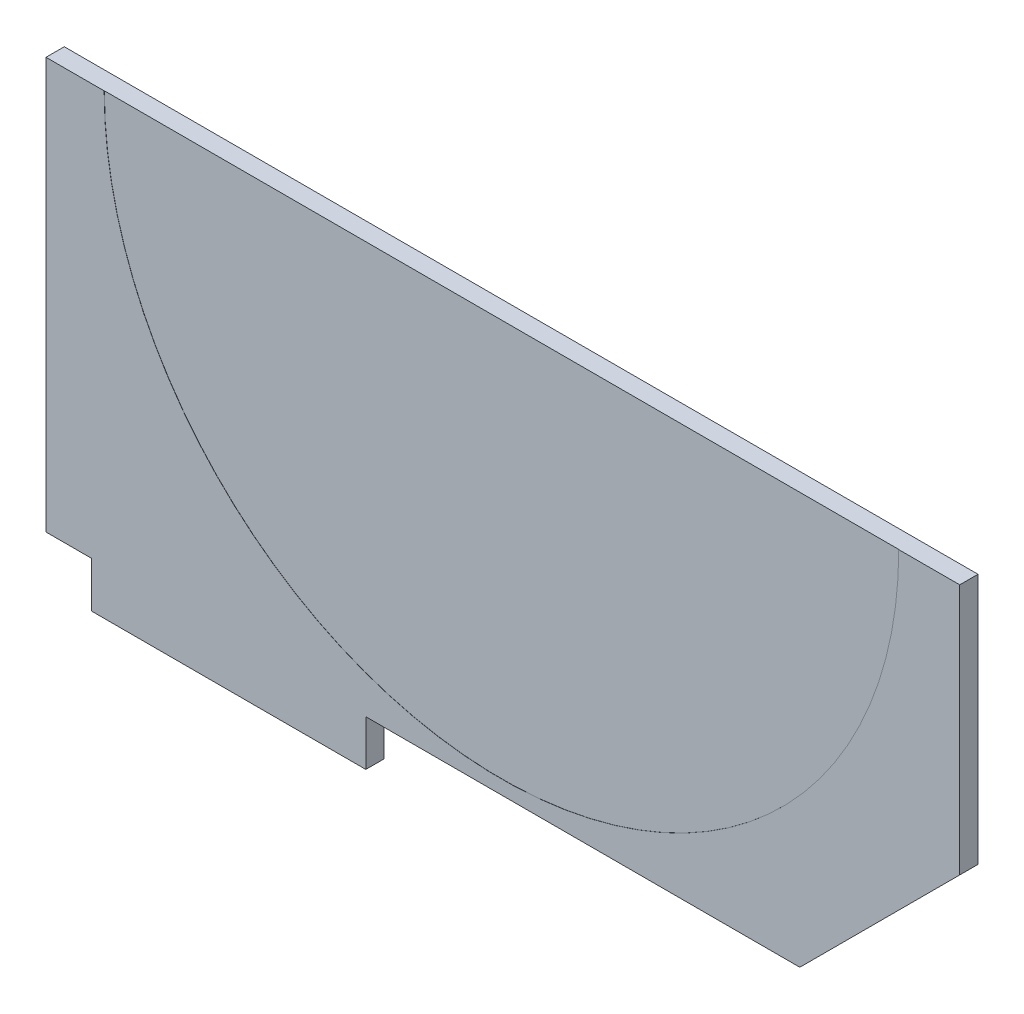
ISO-10303-21;
HEADER;
FILE_DESCRIPTION(('STEP AP214'),'2;1');
FILE_NAME('part.step','',(''),(''),'','','');
FILE_SCHEMA(('AUTOMOTIVE_DESIGN { 1 0 10303 214 1 1 1 1 }'));
ENDSEC;
DATA;
#1=APPLICATION_CONTEXT('core data for automotive mechanical design processes');
#2=APPLICATION_PROTOCOL_DEFINITION('international standard','automotive_design',2000,#1);
#3=PRODUCT_CONTEXT('',#1,'mechanical');
#4=PRODUCT('Part','Part','',(#3));
#5=PRODUCT_RELATED_PRODUCT_CATEGORY('part','',(#4));
#6=PRODUCT_DEFINITION_FORMATION('','',#4);
#7=PRODUCT_DEFINITION_CONTEXT('part definition',#1,'design');
#8=PRODUCT_DEFINITION('design','',#6,#7);
#9=PRODUCT_DEFINITION_SHAPE('','',#8);
#10=(LENGTH_UNIT() NAMED_UNIT(*) SI_UNIT(.MILLI.,.METRE.));
#11=(NAMED_UNIT(*) PLANE_ANGLE_UNIT() SI_UNIT($,.RADIAN.));
#12=(NAMED_UNIT(*) SI_UNIT($,.STERADIAN.) SOLID_ANGLE_UNIT());
#13=UNCERTAINTY_MEASURE_WITH_UNIT(LENGTH_MEASURE(1.E-05),#10,'distance_accuracy_value','');
#14=(GEOMETRIC_REPRESENTATION_CONTEXT(3) GLOBAL_UNCERTAINTY_ASSIGNED_CONTEXT((#13)) GLOBAL_UNIT_ASSIGNED_CONTEXT((#10,
#11,#12)) REPRESENTATION_CONTEXT('',''));
#15=CARTESIAN_POINT('',(0.,0.,0.));
#16=DIRECTION('',(0.,0.,1.));
#17=DIRECTION('',(1.,0.,0.));
#18=AXIS2_PLACEMENT_3D('',#15,#16,#17);
#19=CARTESIAN_POINT('',(0.,0.,0.19));
#20=DIRECTION('',(0.,0.,-1.));
#21=DIRECTION('',(-1.,0.,0.));
#22=AXIS2_PLACEMENT_3D('',#19,#20,#21);
#23=PLANE('',#22);
#24=CARTESIAN_POINT('',(-0.450773361976369,0.800000000000001,0.19));
#25=DIRECTION('',(0.,0.,1.));
#26=DIRECTION('',(-1.,0.,0.));
#27=AXIS2_PLACEMENT_3D('',#24,#25,#26);
#28=CIRCLE('',#27,0.217416756176155);
#29=CARTESIAN_POINT('',(-0.668190118152524,0.800000000000001,0.19));
#30=VERTEX_POINT('',#29);
#31=CARTESIAN_POINT('',(-0.233356605800214,0.800000000000001,0.19));
#32=VERTEX_POINT('',#31);
#33=EDGE_CURVE('E11',#30,#32,#28,.T.);
#34=ORIENTED_EDGE('',*,*,#33,.F.);
#35=DIRECTION('',(1.,0.,0.));
#36=VECTOR('',#35,1.);
#37=CARTESIAN_POINT('',(-0.7,0.800000000000001,0.19));
#38=LINE('',#37,#36);
#39=CARTESIAN_POINT('',(-0.7,0.800000000000001,0.19));
#40=VERTEX_POINT('',#39);
#41=EDGE_CURVE('E24',#40,#30,#38,.T.);
#42=ORIENTED_EDGE('',*,*,#41,.F.);
#43=DIRECTION('',(0.,1.,0.));
#44=VECTOR('',#43,1.);
#45=CARTESIAN_POINT('',(-0.7,0.57499996547462,0.19));
#46=LINE('',#45,#44);
#47=CARTESIAN_POINT('',(-0.7,0.57499996547462,0.19));
#48=VERTEX_POINT('',#47);
#49=EDGE_CURVE('E192',#48,#40,#46,.T.);
#50=ORIENTED_EDGE('',*,*,#49,.F.);
#51=DIRECTION('',(-1.,0.,0.));
#52=VECTOR('',#51,1.);
#53=CARTESIAN_POINT('',(-0.675000034525379,0.57499996547462,0.19));
#54=LINE('',#53,#52);
#55=CARTESIAN_POINT('',(-0.675000034525379,0.57499996547462,0.19));
#56=VERTEX_POINT('',#55);
#57=EDGE_CURVE('E190',#56,#48,#54,.T.);
#58=ORIENTED_EDGE('',*,*,#57,.F.);
#59=DIRECTION('',(0.,1.,0.));
#60=VECTOR('',#59,1.);
#61=CARTESIAN_POINT('',(-0.675000034525379,0.55,0.19));
#62=LINE('',#61,#60);
#63=CARTESIAN_POINT('',(-0.675000034525379,0.55,0.19));
#64=VERTEX_POINT('',#63);
#65=EDGE_CURVE('E102',#64,#56,#62,.T.);
#66=ORIENTED_EDGE('',*,*,#65,.F.);
#67=DIRECTION('',(-1.,0.,0.));
#68=VECTOR('',#67,1.);
#69=CARTESIAN_POINT('',(-0.525000034525379,0.55,0.19));
#70=LINE('',#69,#68);
#71=CARTESIAN_POINT('',(-0.525000034525379,0.55,0.19));
#72=VERTEX_POINT('',#71);
#73=EDGE_CURVE('E186',#72,#64,#70,.T.);
#74=ORIENTED_EDGE('',*,*,#73,.F.);
#75=DIRECTION('',(0.,-1.,0.));
#76=VECTOR('',#75,1.);
#77=CARTESIAN_POINT('',(-0.525000034525379,0.57499996547462,0.19));
#78=LINE('',#77,#76);
#79=CARTESIAN_POINT('',(-0.525000034525379,0.57499996547462,0.19));
#80=VERTEX_POINT('',#79);
#81=EDGE_CURVE('E183',#80,#72,#78,.T.);
#82=ORIENTED_EDGE('',*,*,#81,.F.);
#83=DIRECTION('',(-1.,0.,0.));
#84=VECTOR('',#83,1.);
#85=CARTESIAN_POINT('',(-0.287497534525379,0.57499996547462,0.19));
#86=LINE('',#85,#84);
#87=CARTESIAN_POINT('',(-0.287497534525379,0.57499996547462,0.19));
#88=VERTEX_POINT('',#87);
#89=EDGE_CURVE('E180',#88,#80,#86,.T.);
#90=ORIENTED_EDGE('',*,*,#89,.F.);
#91=DIRECTION('',(-0.707106781186547,-0.707106781186548,0.));
#92=VECTOR('',#91,1.);
#93=CARTESIAN_POINT('',(-0.287497534525379,0.57499996547462,0.19));
#94=LINE('',#93,#92);
#95=CARTESIAN_POINT('',(-0.2,0.6624975,0.19));
#96=VERTEX_POINT('',#95);
#97=EDGE_CURVE('E177',#96,#88,#94,.T.);
#98=ORIENTED_EDGE('',*,*,#97,.F.);
#99=DIRECTION('',(0.,-1.,0.));
#100=VECTOR('',#99,1.);
#101=CARTESIAN_POINT('',(-0.2,0.800000000000001,0.19));
#102=LINE('',#101,#100);
#103=CARTESIAN_POINT('',(-0.2,0.800000000000001,0.19));
#104=VERTEX_POINT('',#103);
#105=EDGE_CURVE('E174',#104,#96,#102,.T.);
#106=ORIENTED_EDGE('',*,*,#105,.F.);
#107=DIRECTION('',(1.,0.,0.));
#108=VECTOR('',#107,1.);
#109=CARTESIAN_POINT('',(-0.7,0.800000000000001,0.19));
#110=LINE('',#109,#108);
#111=EDGE_CURVE('E171',#32,#104,#110,.T.);
#112=ORIENTED_EDGE('',*,*,#111,.F.);
#113=EDGE_LOOP('',(#34,#42,#50,#58,#66,#74,#82,#90,#98,#106,#112));
#114=FACE_BOUND('',#113,.T.);
#115=ADVANCED_FACE('F17',(#114),#23,.F.);
#116=CARTESIAN_POINT('',(-0.7,0.57499996547462,0.18));
#117=DIRECTION('',(1.,0.,0.));
#118=DIRECTION('',(0.,1.,0.));
#119=AXIS2_PLACEMENT_3D('',#116,#117,#118);
#120=PLANE('',#119);
#121=ORIENTED_EDGE('',*,*,#49,.T.);
#122=DIRECTION('',(0.,0.,1.));
#123=VECTOR('',#122,1.);
#124=CARTESIAN_POINT('',(-0.7,0.800000000000001,0.18));
#125=LINE('',#124,#123);
#126=CARTESIAN_POINT('',(-0.7,0.800000000000001,0.18));
#127=VERTEX_POINT('',#126);
#128=EDGE_CURVE('E168',#127,#40,#125,.T.);
#129=ORIENTED_EDGE('',*,*,#128,.F.);
#130=DIRECTION('',(0.,1.,0.));
#131=VECTOR('',#130,1.);
#132=CARTESIAN_POINT('',(-0.7,0.57499996547462,0.18));
#133=LINE('',#132,#131);
#134=CARTESIAN_POINT('',(-0.7,0.57499996547462,0.18));
#135=VERTEX_POINT('',#134);
#136=EDGE_CURVE('E166',#135,#127,#133,.T.);
#137=ORIENTED_EDGE('',*,*,#136,.F.);
#138=DIRECTION('',(0.,0.,1.));
#139=VECTOR('',#138,1.);
#140=CARTESIAN_POINT('',(-0.7,0.57499996547462,0.18));
#141=LINE('',#140,#139);
#142=EDGE_CURVE('E120',#135,#48,#141,.T.);
#143=ORIENTED_EDGE('',*,*,#142,.T.);
#144=EDGE_LOOP('',(#121,#129,#137,#143));
#145=FACE_BOUND('',#144,.T.);
#146=ADVANCED_FACE('F217',(#145),#120,.F.);
#147=CARTESIAN_POINT('',(-0.7,0.800000000000001,0.18));
#148=DIRECTION('',(0.,-1.,0.));
#149=DIRECTION('',(0.,0.,-1.));
#150=AXIS2_PLACEMENT_3D('',#147,#148,#149);
#151=PLANE('',#150);
#152=DIRECTION('',(-1.,0.,0.));
#153=VECTOR('',#152,1.);
#154=CARTESIAN_POINT('',(-0.668190118152524,0.800000000000001,0.1899));
#155=LINE('',#154,#153);
#156=CARTESIAN_POINT('',(-0.233356605800214,0.800000000000001,0.1899));
#157=VERTEX_POINT('',#156);
#158=CARTESIAN_POINT('',(-0.668190118152524,0.800000000000001,0.1899));
#159=VERTEX_POINT('',#158);
#160=EDGE_CURVE('E163',#157,#159,#155,.T.);
#161=ORIENTED_EDGE('',*,*,#160,.F.);
#162=DIRECTION('',(0.,0.,1.));
#163=VECTOR('',#162,1.);
#164=CARTESIAN_POINT('',(-0.233356605800214,0.800000000000001,0.1899));
#165=LINE('',#164,#163);
#166=EDGE_CURVE('E160',#157,#32,#165,.T.);
#167=ORIENTED_EDGE('',*,*,#166,.T.);
#168=ORIENTED_EDGE('',*,*,#111,.T.);
#169=DIRECTION('',(0.,0.,1.));
#170=VECTOR('',#169,1.);
#171=CARTESIAN_POINT('',(-0.2,0.800000000000001,0.18));
#172=LINE('',#171,#170);
#173=CARTESIAN_POINT('',(-0.2,0.800000000000001,0.18));
#174=VERTEX_POINT('',#173);
#175=EDGE_CURVE('E157',#174,#104,#172,.T.);
#176=ORIENTED_EDGE('',*,*,#175,.F.);
#177=DIRECTION('',(1.,0.,0.));
#178=VECTOR('',#177,1.);
#179=CARTESIAN_POINT('',(-0.7,0.800000000000001,0.18));
#180=LINE('',#179,#178);
#181=EDGE_CURVE('E154',#127,#174,#180,.T.);
#182=ORIENTED_EDGE('',*,*,#181,.F.);
#183=ORIENTED_EDGE('',*,*,#128,.T.);
#184=ORIENTED_EDGE('',*,*,#41,.T.);
#185=DIRECTION('',(0.,0.,1.));
#186=VECTOR('',#185,1.);
#187=CARTESIAN_POINT('',(-0.668190118152524,0.800000000000001,0.1899));
#188=LINE('',#187,#186);
#189=EDGE_CURVE('E152',#159,#30,#188,.T.);
#190=ORIENTED_EDGE('',*,*,#189,.F.);
#191=EDGE_LOOP('',(#161,#167,#168,#176,#182,#183,#184,#190));
#192=FACE_BOUND('',#191,.T.);
#193=ADVANCED_FACE('F196',(#192),#151,.F.);
#194=CARTESIAN_POINT('',(-0.2,0.800000000000001,0.18));
#195=DIRECTION('',(-1.,0.,0.));
#196=DIRECTION('',(0.,-1.,0.));
#197=AXIS2_PLACEMENT_3D('',#194,#195,#196);
#198=PLANE('',#197);
#199=ORIENTED_EDGE('',*,*,#105,.T.);
#200=DIRECTION('',(0.,0.,1.));
#201=VECTOR('',#200,1.);
#202=CARTESIAN_POINT('',(-0.2,0.6624975,0.18));
#203=LINE('',#202,#201);
#204=CARTESIAN_POINT('',(-0.2,0.6624975,0.18));
#205=VERTEX_POINT('',#204);
#206=EDGE_CURVE('E149',#205,#96,#203,.T.);
#207=ORIENTED_EDGE('',*,*,#206,.F.);
#208=DIRECTION('',(0.,-1.,0.));
#209=VECTOR('',#208,1.);
#210=CARTESIAN_POINT('',(-0.2,0.800000000000001,0.18));
#211=LINE('',#210,#209);
#212=EDGE_CURVE('E146',#174,#205,#211,.T.);
#213=ORIENTED_EDGE('',*,*,#212,.F.);
#214=ORIENTED_EDGE('',*,*,#175,.T.);
#215=EDGE_LOOP('',(#199,#207,#213,#214));
#216=FACE_BOUND('',#215,.T.);
#217=ADVANCED_FACE('F204',(#216),#198,.F.);
#218=CARTESIAN_POINT('',(-0.287497534525379,0.57499996547462,0.18));
#219=DIRECTION('',(-0.707106781186548,0.707106781186547,0.));
#220=DIRECTION('',(-0.707106781186547,-0.707106781186548,0.));
#221=AXIS2_PLACEMENT_3D('',#218,#219,#220);
#222=PLANE('',#221);
#223=ORIENTED_EDGE('',*,*,#97,.T.);
#224=DIRECTION('',(0.,0.,1.));
#225=VECTOR('',#224,1.);
#226=CARTESIAN_POINT('',(-0.287497534525379,0.57499996547462,0.18));
#227=LINE('',#226,#225);
#228=CARTESIAN_POINT('',(-0.287497534525379,0.57499996547462,0.18));
#229=VERTEX_POINT('',#228);
#230=EDGE_CURVE('E143',#229,#88,#227,.T.);
#231=ORIENTED_EDGE('',*,*,#230,.F.);
#232=DIRECTION('',(-0.707106781186547,-0.707106781186548,0.));
#233=VECTOR('',#232,1.);
#234=CARTESIAN_POINT('',(-0.287497534525379,0.57499996547462,0.18));
#235=LINE('',#234,#233);
#236=EDGE_CURVE('E140',#205,#229,#235,.T.);
#237=ORIENTED_EDGE('',*,*,#236,.F.);
#238=ORIENTED_EDGE('',*,*,#206,.T.);
#239=EDGE_LOOP('',(#223,#231,#237,#238));
#240=FACE_BOUND('',#239,.T.);
#241=ADVANCED_FACE('F208',(#240),#222,.F.);
#242=CARTESIAN_POINT('',(-0.287497534525379,0.57499996547462,0.18));
#243=DIRECTION('',(0.,1.,0.));
#244=DIRECTION('',(0.,0.,1.));
#245=AXIS2_PLACEMENT_3D('',#242,#243,#244);
#246=PLANE('',#245);
#247=ORIENTED_EDGE('',*,*,#89,.T.);
#248=DIRECTION('',(0.,0.,1.));
#249=VECTOR('',#248,1.);
#250=CARTESIAN_POINT('',(-0.525000034525379,0.57499996547462,0.18));
#251=LINE('',#250,#249);
#252=CARTESIAN_POINT('',(-0.525000034525379,0.57499996547462,0.18));
#253=VERTEX_POINT('',#252);
#254=EDGE_CURVE('E137',#253,#80,#251,.T.);
#255=ORIENTED_EDGE('',*,*,#254,.F.);
#256=DIRECTION('',(-1.,0.,0.));
#257=VECTOR('',#256,1.);
#258=CARTESIAN_POINT('',(-0.287497534525379,0.57499996547462,0.18));
#259=LINE('',#258,#257);
#260=EDGE_CURVE('E134',#229,#253,#259,.T.);
#261=ORIENTED_EDGE('',*,*,#260,.F.);
#262=ORIENTED_EDGE('',*,*,#230,.T.);
#263=EDGE_LOOP('',(#247,#255,#261,#262));
#264=FACE_BOUND('',#263,.T.);
#265=ADVANCED_FACE('F210',(#264),#246,.F.);
#266=CARTESIAN_POINT('',(-0.525000034525379,0.57499996547462,0.18));
#267=DIRECTION('',(-1.,0.,0.));
#268=DIRECTION('',(0.,0.,1.));
#269=AXIS2_PLACEMENT_3D('',#266,#267,#268);
#270=PLANE('',#269);
#271=ORIENTED_EDGE('',*,*,#81,.T.);
#272=DIRECTION('',(0.,0.,1.));
#273=VECTOR('',#272,1.);
#274=CARTESIAN_POINT('',(-0.525000034525379,0.55,0.18));
#275=LINE('',#274,#273);
#276=CARTESIAN_POINT('',(-0.525000034525379,0.55,0.18));
#277=VERTEX_POINT('',#276);
#278=EDGE_CURVE('E131',#277,#72,#275,.T.);
#279=ORIENTED_EDGE('',*,*,#278,.F.);
#280=DIRECTION('',(0.,-1.,0.));
#281=VECTOR('',#280,1.);
#282=CARTESIAN_POINT('',(-0.525000034525379,0.57499996547462,0.18));
#283=LINE('',#282,#281);
#284=EDGE_CURVE('E129',#253,#277,#283,.T.);
#285=ORIENTED_EDGE('',*,*,#284,.F.);
#286=ORIENTED_EDGE('',*,*,#254,.T.);
#287=EDGE_LOOP('',(#271,#279,#285,#286));
#288=FACE_BOUND('',#287,.T.);
#289=ADVANCED_FACE('F213',(#288),#270,.F.);
#290=CARTESIAN_POINT('',(-0.525000034525379,0.55,0.18));
#291=DIRECTION('',(0.,1.,0.));
#292=DIRECTION('',(0.,0.,1.));
#293=AXIS2_PLACEMENT_3D('',#290,#291,#292);
#294=PLANE('',#293);
#295=ORIENTED_EDGE('',*,*,#73,.T.);
#296=DIRECTION('',(0.,0.,1.));
#297=VECTOR('',#296,1.);
#298=CARTESIAN_POINT('',(-0.675000034525379,0.55,0.18));
#299=LINE('',#298,#297);
#300=CARTESIAN_POINT('',(-0.675000034525379,0.55,0.18));
#301=VERTEX_POINT('',#300);
#302=EDGE_CURVE('E127',#301,#64,#299,.T.);
#303=ORIENTED_EDGE('',*,*,#302,.F.);
#304=DIRECTION('',(-1.,0.,0.));
#305=VECTOR('',#304,1.);
#306=CARTESIAN_POINT('',(-0.525000034525379,0.55,0.18));
#307=LINE('',#306,#305);
#308=EDGE_CURVE('E106',#277,#301,#307,.T.);
#309=ORIENTED_EDGE('',*,*,#308,.F.);
#310=ORIENTED_EDGE('',*,*,#278,.T.);
#311=EDGE_LOOP('',(#295,#303,#309,#310));
#312=FACE_BOUND('',#311,.T.);
#313=ADVANCED_FACE('F215',(#312),#294,.F.);
#314=CARTESIAN_POINT('',(-0.675000034525379,0.55,0.18));
#315=DIRECTION('',(1.,0.,0.));
#316=DIRECTION('',(0.,0.,-1.));
#317=AXIS2_PLACEMENT_3D('',#314,#315,#316);
#318=PLANE('',#317);
#319=ORIENTED_EDGE('',*,*,#65,.T.);
#320=DIRECTION('',(0.,0.,1.));
#321=VECTOR('',#320,1.);
#322=CARTESIAN_POINT('',(-0.675000034525379,0.57499996547462,0.18));
#323=LINE('',#322,#321);
#324=CARTESIAN_POINT('',(-0.675000034525379,0.57499996547462,0.18));
#325=VERTEX_POINT('',#324);
#326=EDGE_CURVE('E97',#325,#56,#323,.T.);
#327=ORIENTED_EDGE('',*,*,#326,.F.);
#328=DIRECTION('',(0.,1.,0.));
#329=VECTOR('',#328,1.);
#330=CARTESIAN_POINT('',(-0.675000034525379,0.55,0.18));
#331=LINE('',#330,#329);
#332=EDGE_CURVE('E101',#301,#325,#331,.T.);
#333=ORIENTED_EDGE('',*,*,#332,.F.);
#334=ORIENTED_EDGE('',*,*,#302,.T.);
#335=EDGE_LOOP('',(#319,#327,#333,#334));
#336=FACE_BOUND('',#335,.T.);
#337=ADVANCED_FACE('F99',(#336),#318,.F.);
#338=CARTESIAN_POINT('',(-0.675000034525379,0.57499996547462,0.18));
#339=DIRECTION('',(0.,1.,0.));
#340=DIRECTION('',(0.,0.,1.));
#341=AXIS2_PLACEMENT_3D('',#338,#339,#340);
#342=PLANE('',#341);
#343=ORIENTED_EDGE('',*,*,#57,.T.);
#344=ORIENTED_EDGE('',*,*,#142,.F.);
#345=DIRECTION('',(-1.,0.,0.));
#346=VECTOR('',#345,1.);
#347=CARTESIAN_POINT('',(-0.675000034525379,0.57499996547462,0.18));
#348=LINE('',#347,#346);
#349=EDGE_CURVE('E113',#325,#135,#348,.T.);
#350=ORIENTED_EDGE('',*,*,#349,.F.);
#351=ORIENTED_EDGE('',*,*,#326,.T.);
#352=EDGE_LOOP('',(#343,#344,#350,#351));
#353=FACE_BOUND('',#352,.T.);
#354=ADVANCED_FACE('F118',(#353),#342,.F.);
#355=CARTESIAN_POINT('',(0.,0.,0.18));
#356=DIRECTION('',(0.,0.,-1.));
#357=DIRECTION('',(-1.,0.,0.));
#358=AXIS2_PLACEMENT_3D('',#355,#356,#357);
#359=PLANE('',#358);
#360=ORIENTED_EDGE('',*,*,#136,.T.);
#361=ORIENTED_EDGE('',*,*,#181,.T.);
#362=ORIENTED_EDGE('',*,*,#212,.T.);
#363=ORIENTED_EDGE('',*,*,#236,.T.);
#364=ORIENTED_EDGE('',*,*,#260,.T.);
#365=ORIENTED_EDGE('',*,*,#284,.T.);
#366=ORIENTED_EDGE('',*,*,#308,.T.);
#367=ORIENTED_EDGE('',*,*,#332,.T.);
#368=ORIENTED_EDGE('',*,*,#349,.T.);
#369=EDGE_LOOP('',(#360,#361,#362,#363,#364,#365,#366,#367,#368));
#370=FACE_BOUND('',#369,.T.);
#371=ADVANCED_FACE('F112',(#370),#359,.T.);
#372=CARTESIAN_POINT('',(-0.450773361976369,0.800000000000001,0.1899));
#373=DIRECTION('',(0.,0.,1.));
#374=DIRECTION('',(1.,0.,0.));
#375=AXIS2_PLACEMENT_3D('',#372,#373,#374);
#376=CYLINDRICAL_SURFACE('',#375,0.217416756176155);
#377=ORIENTED_EDGE('',*,*,#33,.T.);
#378=ORIENTED_EDGE('',*,*,#166,.F.);
#379=CARTESIAN_POINT('',(-0.450773361976369,0.800000000000001,0.1899));
#380=DIRECTION('',(0.,0.,1.));
#381=DIRECTION('',(-1.,0.,0.));
#382=AXIS2_PLACEMENT_3D('',#379,#380,#381);
#383=CIRCLE('',#382,0.217416756176155);
#384=EDGE_CURVE('E121',#159,#157,#383,.T.);
#385=ORIENTED_EDGE('',*,*,#384,.F.);
#386=ORIENTED_EDGE('',*,*,#189,.T.);
#387=EDGE_LOOP('',(#377,#378,#385,#386));
#388=FACE_BOUND('',#387,.T.);
#389=ADVANCED_FACE('F199',(#388),#376,.F.);
#390=CARTESIAN_POINT('',(-0.450773361976369,0.800000000000001,0.1899));
#391=DIRECTION('',(0.,0.,1.));
#392=DIRECTION('',(1.,0.,0.));
#393=AXIS2_PLACEMENT_3D('',#390,#391,#392);
#394=PLANE('',#393);
#395=ORIENTED_EDGE('',*,*,#160,.T.);
#396=ORIENTED_EDGE('',*,*,#384,.T.);
#397=EDGE_LOOP('',(#395,#396));
#398=FACE_BOUND('',#397,.T.);
#399=ADVANCED_FACE('F201',(#398),#394,.T.);
#400=CLOSED_SHELL('',(#115,#146,#193,#217,#241,#265,#289,#313,#337,#354,#371,#389,#399));
#401=MANIFOLD_SOLID_BREP('B1',#400);
#402=ADVANCED_BREP_SHAPE_REPRESENTATION('',(#18,#401),#14);
#403=SHAPE_DEFINITION_REPRESENTATION(#9,#402);
ENDSEC;
END-ISO-10303-21;
